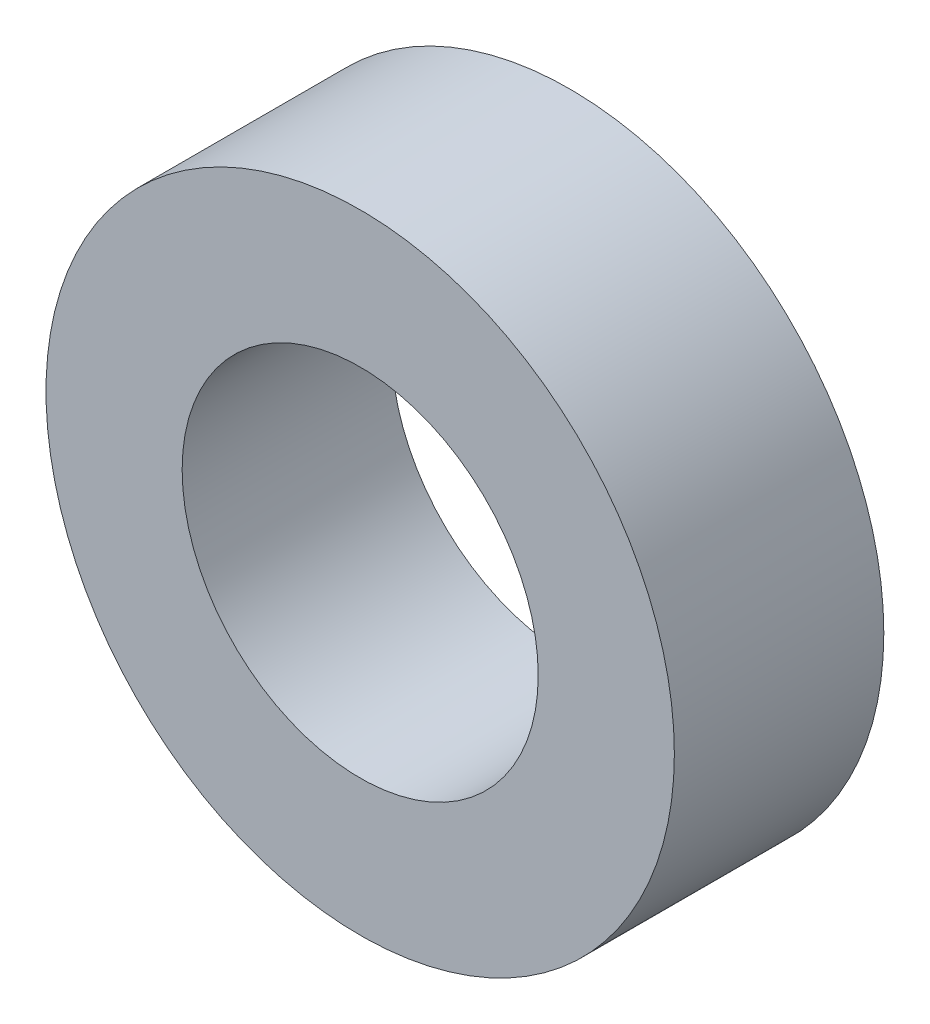
ISO-10303-21;
HEADER;
FILE_DESCRIPTION(('STEP AP214'),'2;1');
FILE_NAME('part.step','',(''),(''),'','','');
FILE_SCHEMA(('AUTOMOTIVE_DESIGN { 1 0 10303 214 1 1 1 1 }'));
ENDSEC;
DATA;
#1=APPLICATION_CONTEXT('core data for automotive mechanical design processes');
#2=APPLICATION_PROTOCOL_DEFINITION('international standard','automotive_design',2000,#1);
#3=PRODUCT_CONTEXT('',#1,'mechanical');
#4=PRODUCT('Part','Part','',(#3));
#5=PRODUCT_RELATED_PRODUCT_CATEGORY('part','',(#4));
#6=PRODUCT_DEFINITION_FORMATION('','',#4);
#7=PRODUCT_DEFINITION_CONTEXT('part definition',#1,'design');
#8=PRODUCT_DEFINITION('design','',#6,#7);
#9=PRODUCT_DEFINITION_SHAPE('','',#8);
#10=(LENGTH_UNIT() NAMED_UNIT(*) SI_UNIT(.MILLI.,.METRE.));
#11=(NAMED_UNIT(*) PLANE_ANGLE_UNIT() SI_UNIT($,.RADIAN.));
#12=(NAMED_UNIT(*) SI_UNIT($,.STERADIAN.) SOLID_ANGLE_UNIT());
#13=UNCERTAINTY_MEASURE_WITH_UNIT(LENGTH_MEASURE(1.E-05),#10,'distance_accuracy_value','');
#14=(GEOMETRIC_REPRESENTATION_CONTEXT(3) GLOBAL_UNCERTAINTY_ASSIGNED_CONTEXT((#13)) GLOBAL_UNIT_ASSIGNED_CONTEXT((#10,
#11,#12)) REPRESENTATION_CONTEXT('',''));
#15=CARTESIAN_POINT('',(0.,0.,0.));
#16=DIRECTION('',(0.,0.,1.));
#17=DIRECTION('',(1.,0.,0.));
#18=AXIS2_PLACEMENT_3D('',#15,#16,#17);
#19=CARTESIAN_POINT('',(-147.,33.,69.));
#20=DIRECTION('',(0.,0.,1.));
#21=DIRECTION('',(1.,0.,0.));
#22=AXIS2_PLACEMENT_3D('',#19,#20,#21);
#23=CYLINDRICAL_SURFACE('',#22,3.);
#24=CARTESIAN_POINT('',(-147.,33.,69.));
#25=DIRECTION('',(0.,0.,1.));
#26=DIRECTION('',(1.,0.,0.));
#27=AXIS2_PLACEMENT_3D('',#24,#25,#26);
#28=CIRCLE('',#27,3.);
#29=CARTESIAN_POINT('',(-144.,33.,69.));
#30=VERTEX_POINT('',#29);
#31=EDGE_CURVE('E10',#30,#30,#28,.T.);
#32=ORIENTED_EDGE('',*,*,#31,.T.);
#33=EDGE_LOOP('',(#32));
#34=FACE_BOUND('',#33,.T.);
#35=CARTESIAN_POINT('',(-147.,33.,71.));
#36=DIRECTION('',(0.,0.,1.));
#37=DIRECTION('',(1.,0.,0.));
#38=AXIS2_PLACEMENT_3D('',#35,#36,#37);
#39=CIRCLE('',#38,3.);
#40=CARTESIAN_POINT('',(-144.,33.,71.));
#41=VERTEX_POINT('',#40);
#42=EDGE_CURVE('E45',#41,#41,#39,.T.);
#43=ORIENTED_EDGE('',*,*,#42,.F.);
#44=EDGE_LOOP('',(#43));
#45=FACE_BOUND('',#44,.T.);
#46=ADVANCED_FACE('F39',(#34,#45),#23,.T.);
#47=CARTESIAN_POINT('',(-147.,33.,69.));
#48=DIRECTION('',(0.,0.,1.));
#49=DIRECTION('',(1.,0.,0.));
#50=AXIS2_PLACEMENT_3D('',#47,#48,#49);
#51=PLANE('',#50);
#52=CARTESIAN_POINT('',(-147.,33.,69.));
#53=DIRECTION('',(0.,0.,1.));
#54=DIRECTION('',(1.,0.,0.));
#55=AXIS2_PLACEMENT_3D('',#52,#53,#54);
#56=CIRCLE('',#55,1.70000000000001);
#57=CARTESIAN_POINT('',(-145.3,33.,69.));
#58=VERTEX_POINT('',#57);
#59=EDGE_CURVE('E47',#58,#58,#56,.T.);
#60=ORIENTED_EDGE('',*,*,#59,.T.);
#61=EDGE_LOOP('',(#60));
#62=FACE_BOUND('',#61,.T.);
#63=ORIENTED_EDGE('',*,*,#31,.F.);
#64=EDGE_LOOP('',(#63));
#65=FACE_BOUND('',#64,.T.);
#66=ADVANCED_FACE('F60',(#62,#65),#51,.F.);
#67=CARTESIAN_POINT('',(-147.,33.,71.));
#68=DIRECTION('',(0.,0.,1.));
#69=DIRECTION('',(1.,0.,0.));
#70=AXIS2_PLACEMENT_3D('',#67,#68,#69);
#71=PLANE('',#70);
#72=CARTESIAN_POINT('',(-147.,33.,71.));
#73=DIRECTION('',(0.,0.,1.));
#74=DIRECTION('',(1.,0.,0.));
#75=AXIS2_PLACEMENT_3D('',#72,#73,#74);
#76=CIRCLE('',#75,1.70000000000001);
#77=CARTESIAN_POINT('',(-145.3,33.,71.));
#78=VERTEX_POINT('',#77);
#79=EDGE_CURVE('E51',#78,#78,#76,.T.);
#80=ORIENTED_EDGE('',*,*,#79,.F.);
#81=EDGE_LOOP('',(#80));
#82=FACE_BOUND('',#81,.T.);
#83=ORIENTED_EDGE('',*,*,#42,.T.);
#84=EDGE_LOOP('',(#83));
#85=FACE_BOUND('',#84,.T.);
#86=ADVANCED_FACE('F64',(#82,#85),#71,.T.);
#87=CARTESIAN_POINT('',(-147.,33.,69.));
#88=DIRECTION('',(0.,0.,1.));
#89=DIRECTION('',(1.,0.,0.));
#90=AXIS2_PLACEMENT_3D('',#87,#88,#89);
#91=CYLINDRICAL_SURFACE('',#90,1.70000000000001);
#92=ORIENTED_EDGE('',*,*,#59,.F.);
#93=EDGE_LOOP('',(#92));
#94=FACE_BOUND('',#93,.T.);
#95=ORIENTED_EDGE('',*,*,#79,.T.);
#96=EDGE_LOOP('',(#95));
#97=FACE_BOUND('',#96,.T.);
#98=ADVANCED_FACE('F58',(#94,#97),#91,.F.);
#99=CLOSED_SHELL('',(#46,#66,#86,#98));
#100=MANIFOLD_SOLID_BREP('B2',#99);
#101=ADVANCED_BREP_SHAPE_REPRESENTATION('',(#18,#100),#14);
#102=SHAPE_DEFINITION_REPRESENTATION(#9,#101);
ENDSEC;
END-ISO-10303-21;
